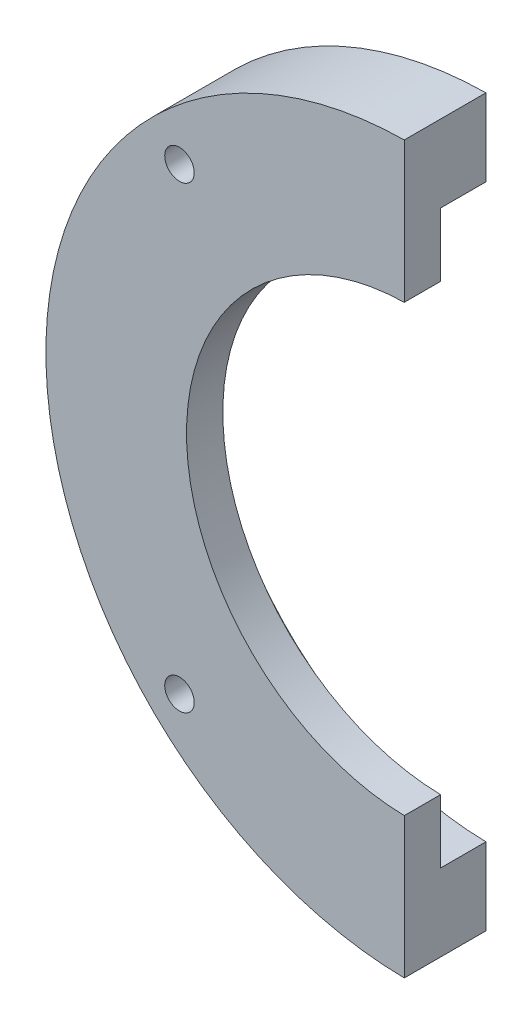
ISO-10303-21;
HEADER;
FILE_DESCRIPTION(('STEP AP214'),'2;1');
FILE_NAME('part.step','',(''),(''),'','','');
FILE_SCHEMA(('AUTOMOTIVE_DESIGN { 1 0 10303 214 1 1 1 1 }'));
ENDSEC;
DATA;
#1=APPLICATION_CONTEXT('core data for automotive mechanical design processes');
#2=APPLICATION_PROTOCOL_DEFINITION('international standard','automotive_design',2000,#1);
#3=PRODUCT_CONTEXT('',#1,'mechanical');
#4=PRODUCT('Part','Part','',(#3));
#5=PRODUCT_RELATED_PRODUCT_CATEGORY('part','',(#4));
#6=PRODUCT_DEFINITION_FORMATION('','',#4);
#7=PRODUCT_DEFINITION_CONTEXT('part definition',#1,'design');
#8=PRODUCT_DEFINITION('design','',#6,#7);
#9=PRODUCT_DEFINITION_SHAPE('','',#8);
#10=(LENGTH_UNIT() NAMED_UNIT(*) SI_UNIT(.MILLI.,.METRE.));
#11=(NAMED_UNIT(*) PLANE_ANGLE_UNIT() SI_UNIT($,.RADIAN.));
#12=(NAMED_UNIT(*) SI_UNIT($,.STERADIAN.) SOLID_ANGLE_UNIT());
#13=UNCERTAINTY_MEASURE_WITH_UNIT(LENGTH_MEASURE(1.E-05),#10,'distance_accuracy_value','');
#14=(GEOMETRIC_REPRESENTATION_CONTEXT(3) GLOBAL_UNCERTAINTY_ASSIGNED_CONTEXT((#13)) GLOBAL_UNIT_ASSIGNED_CONTEXT((#10,
#11,#12)) REPRESENTATION_CONTEXT('',''));
#15=CARTESIAN_POINT('',(0.,0.,0.));
#16=DIRECTION('',(0.,0.,1.));
#17=DIRECTION('',(1.,0.,0.));
#18=AXIS2_PLACEMENT_3D('',#15,#16,#17);
#19=CARTESIAN_POINT('',(0.,0.,18.));
#20=DIRECTION('',(0.,0.,-1.));
#21=DIRECTION('',(-1.,0.,0.));
#22=AXIS2_PLACEMENT_3D('',#19,#20,#21);
#23=CYLINDRICAL_SURFACE('',#22,80.);
#24=CARTESIAN_POINT('',(0.,0.,18.));
#25=DIRECTION('',(0.,0.,1.));
#26=DIRECTION('',(1.,0.,0.));
#27=AXIS2_PLACEMENT_3D('',#24,#25,#26);
#28=CIRCLE('',#27,80.);
#29=CARTESIAN_POINT('',(-1.,79.9937497558403,18.));
#30=VERTEX_POINT('',#29);
#31=CARTESIAN_POINT('',(-1.,-79.9937497558403,18.));
#32=VERTEX_POINT('',#31);
#33=EDGE_CURVE('E107',#30,#32,#28,.T.);
#34=ORIENTED_EDGE('',*,*,#33,.F.);
#35=DIRECTION('',(0.,0.,-1.));
#36=VECTOR('',#35,1.);
#37=CARTESIAN_POINT('',(-1.,79.9937497558403,18.));
#38=LINE('',#37,#36);
#39=CARTESIAN_POINT('',(-1.,79.9937497558403,0.));
#40=VERTEX_POINT('',#39);
#41=EDGE_CURVE('E94',#30,#40,#38,.T.);
#42=ORIENTED_EDGE('',*,*,#41,.T.);
#43=CARTESIAN_POINT('',(0.,0.,0.));
#44=DIRECTION('',(0.,0.,1.));
#45=DIRECTION('',(1.,0.,0.));
#46=AXIS2_PLACEMENT_3D('',#43,#44,#45);
#47=CIRCLE('',#46,80.);
#48=CARTESIAN_POINT('',(-1.,-79.9937497558403,0.));
#49=VERTEX_POINT('',#48);
#50=EDGE_CURVE('E101',#40,#49,#47,.T.);
#51=ORIENTED_EDGE('',*,*,#50,.T.);
#52=DIRECTION('',(0.,0.,-1.));
#53=VECTOR('',#52,1.);
#54=CARTESIAN_POINT('',(-1.,-79.9937497558403,18.));
#55=LINE('',#54,#53);
#56=EDGE_CURVE('E83',#32,#49,#55,.T.);
#57=ORIENTED_EDGE('',*,*,#56,.F.);
#58=EDGE_LOOP('',(#34,#42,#51,#57));
#59=FACE_BOUND('',#58,.T.);
#60=ADVANCED_FACE('F34',(#59),#23,.T.);
#61=CARTESIAN_POINT('',(0.,0.,18.));
#62=DIRECTION('',(0.,0.,1.));
#63=DIRECTION('',(1.,0.,0.));
#64=AXIS2_PLACEMENT_3D('',#61,#62,#63);
#65=PLANE('',#64);
#66=DIRECTION('',(0.,1.,0.));
#67=VECTOR('',#66,1.);
#68=CARTESIAN_POINT('',(-1.,-79.9937497558403,18.));
#69=LINE('',#68,#67);
#70=CARTESIAN_POINT('',(-1.,48.9897948556636,18.));
#71=VERTEX_POINT('',#70);
#72=EDGE_CURVE('E56',#71,#30,#69,.T.);
#73=ORIENTED_EDGE('',*,*,#72,.T.);
#74=ORIENTED_EDGE('',*,*,#33,.T.);
#75=CARTESIAN_POINT('',(-1.,-48.9897948556636,18.));
#76=VERTEX_POINT('',#75);
#77=EDGE_CURVE('E89',#32,#76,#69,.T.);
#78=ORIENTED_EDGE('',*,*,#77,.T.);
#79=CARTESIAN_POINT('',(0.,0.,18.));
#80=DIRECTION('',(0.,0.,-1.));
#81=DIRECTION('',(-1.,0.,0.));
#82=AXIS2_PLACEMENT_3D('',#79,#80,#81);
#83=CIRCLE('',#82,49.);
#84=EDGE_CURVE('E121',#76,#71,#83,.T.);
#85=ORIENTED_EDGE('',*,*,#84,.T.);
#86=EDGE_LOOP('',(#73,#74,#78,#85));
#87=FACE_BOUND('',#86,.T.);
#88=CARTESIAN_POINT('',(-50.558134854838,50.5581348548383,18.));
#89=DIRECTION('',(0.,0.,1.));
#90=DIRECTION('',(0.,-1.,0.));
#91=AXIS2_PLACEMENT_3D('',#88,#89,#90);
#92=CIRCLE('',#91,3.25);
#93=CARTESIAN_POINT('',(-50.558134854838,47.3081348548383,18.));
#94=VERTEX_POINT('',#93);
#95=EDGE_CURVE('E147',#94,#94,#92,.T.);
#96=ORIENTED_EDGE('',*,*,#95,.F.);
#97=EDGE_LOOP('',(#96));
#98=FACE_BOUND('',#97,.T.);
#99=CARTESIAN_POINT('',(-50.5581348548382,-50.5581348548382,18.));
#100=DIRECTION('',(0.,0.,1.));
#101=DIRECTION('',(1.,0.,0.));
#102=AXIS2_PLACEMENT_3D('',#99,#100,#101);
#103=CIRCLE('',#102,3.25);
#104=CARTESIAN_POINT('',(-47.3081348548381,-50.5581348548382,18.));
#105=VERTEX_POINT('',#104);
#106=EDGE_CURVE('E132',#105,#105,#103,.T.);
#107=ORIENTED_EDGE('',*,*,#106,.F.);
#108=EDGE_LOOP('',(#107));
#109=FACE_BOUND('',#108,.T.);
#110=ADVANCED_FACE('F154',(#87,#98,#109),#65,.T.);
#111=CARTESIAN_POINT('',(0.,0.,0.));
#112=DIRECTION('',(0.,0.,1.));
#113=DIRECTION('',(1.,0.,0.));
#114=AXIS2_PLACEMENT_3D('',#111,#112,#113);
#115=PLANE('',#114);
#116=CARTESIAN_POINT('',(-50.558134854838,50.5581348548383,0.));
#117=DIRECTION('',(0.,0.,1.));
#118=DIRECTION('',(0.,-1.,0.));
#119=AXIS2_PLACEMENT_3D('',#116,#117,#118);
#120=CIRCLE('',#119,3.25);
#121=CARTESIAN_POINT('',(-50.558134854838,47.3081348548383,0.));
#122=VERTEX_POINT('',#121);
#123=EDGE_CURVE('E144',#122,#122,#120,.T.);
#124=ORIENTED_EDGE('',*,*,#123,.T.);
#125=EDGE_LOOP('',(#124));
#126=FACE_BOUND('',#125,.T.);
#127=CARTESIAN_POINT('',(-50.5581348548382,-50.5581348548382,0.));
#128=DIRECTION('',(0.,0.,1.));
#129=DIRECTION('',(1.,0.,0.));
#130=AXIS2_PLACEMENT_3D('',#127,#128,#129);
#131=CIRCLE('',#130,3.25);
#132=CARTESIAN_POINT('',(-47.3081348548381,-50.5581348548382,0.));
#133=VERTEX_POINT('',#132);
#134=EDGE_CURVE('E127',#133,#133,#131,.T.);
#135=ORIENTED_EDGE('',*,*,#134,.T.);
#136=EDGE_LOOP('',(#135));
#137=FACE_BOUND('',#136,.T.);
#138=ORIENTED_EDGE('',*,*,#50,.F.);
#139=DIRECTION('',(0.,1.,0.));
#140=VECTOR('',#139,1.);
#141=CARTESIAN_POINT('',(-1.,-79.9937497558403,0.));
#142=LINE('',#141,#140);
#143=CARTESIAN_POINT('',(-1.,62.9920629920945,0.));
#144=VERTEX_POINT('',#143);
#145=EDGE_CURVE('E104',#144,#40,#142,.T.);
#146=ORIENTED_EDGE('',*,*,#145,.F.);
#147=CARTESIAN_POINT('',(0.,0.,0.));
#148=DIRECTION('',(0.,0.,-1.));
#149=DIRECTION('',(-1.,0.,0.));
#150=AXIS2_PLACEMENT_3D('',#147,#148,#149);
#151=CIRCLE('',#150,63.);
#152=CARTESIAN_POINT('',(-1.,-62.9920629920945,0.));
#153=VERTEX_POINT('',#152);
#154=EDGE_CURVE('E103',#153,#144,#151,.T.);
#155=ORIENTED_EDGE('',*,*,#154,.F.);
#156=EDGE_CURVE('E86',#49,#153,#142,.T.);
#157=ORIENTED_EDGE('',*,*,#156,.F.);
#158=EDGE_LOOP('',(#138,#146,#155,#157));
#159=FACE_BOUND('',#158,.T.);
#160=ADVANCED_FACE('F99',(#126,#137,#159),#115,.F.);
#161=CARTESIAN_POINT('',(0.,0.,10.));
#162=DIRECTION('',(0.,0.,-1.));
#163=DIRECTION('',(-1.,0.,0.));
#164=AXIS2_PLACEMENT_3D('',#161,#162,#163);
#165=CYLINDRICAL_SURFACE('',#164,63.);
#166=ORIENTED_EDGE('',*,*,#154,.T.);
#167=DIRECTION('',(0.,0.,-1.));
#168=VECTOR('',#167,1.);
#169=CARTESIAN_POINT('',(-1.,62.9920629920945,10.));
#170=LINE('',#169,#168);
#171=CARTESIAN_POINT('',(-1.,62.9920629920945,10.));
#172=VERTEX_POINT('',#171);
#173=EDGE_CURVE('E138',#144,#172,#170,.F.);
#174=ORIENTED_EDGE('',*,*,#173,.T.);
#175=CARTESIAN_POINT('',(0.,0.,10.));
#176=DIRECTION('',(0.,0.,-1.));
#177=DIRECTION('',(-1.,0.,0.));
#178=AXIS2_PLACEMENT_3D('',#175,#176,#177);
#179=CIRCLE('',#178,63.);
#180=CARTESIAN_POINT('',(-1.,-62.9920629920945,10.));
#181=VERTEX_POINT('',#180);
#182=EDGE_CURVE('E108',#181,#172,#179,.T.);
#183=ORIENTED_EDGE('',*,*,#182,.F.);
#184=DIRECTION('',(0.,0.,-1.));
#185=VECTOR('',#184,1.);
#186=CARTESIAN_POINT('',(-1.,-62.9920629920945,10.));
#187=LINE('',#186,#185);
#188=EDGE_CURVE('E139',#181,#153,#187,.T.);
#189=ORIENTED_EDGE('',*,*,#188,.T.);
#190=EDGE_LOOP('',(#166,#174,#183,#189));
#191=FACE_BOUND('',#190,.T.);
#192=ADVANCED_FACE('F137',(#191),#165,.F.);
#193=CARTESIAN_POINT('',(0.,0.,10.));
#194=DIRECTION('',(0.,0.,-1.));
#195=DIRECTION('',(-1.,0.,0.));
#196=AXIS2_PLACEMENT_3D('',#193,#194,#195);
#197=PLANE('',#196);
#198=DIRECTION('',(0.,1.,0.));
#199=VECTOR('',#198,1.);
#200=CARTESIAN_POINT('',(-1.,0.,10.));
#201=LINE('',#200,#199);
#202=CARTESIAN_POINT('',(-1.,-48.9897948556636,10.));
#203=VERTEX_POINT('',#202);
#204=EDGE_CURVE('E48',#181,#203,#201,.T.);
#205=ORIENTED_EDGE('',*,*,#204,.F.);
#206=ORIENTED_EDGE('',*,*,#182,.T.);
#207=CARTESIAN_POINT('',(-1.,48.9897948556636,10.));
#208=VERTEX_POINT('',#207);
#209=EDGE_CURVE('E126',#208,#172,#201,.T.);
#210=ORIENTED_EDGE('',*,*,#209,.F.);
#211=CARTESIAN_POINT('',(0.,0.,10.));
#212=DIRECTION('',(0.,0.,-1.));
#213=DIRECTION('',(-1.,0.,0.));
#214=AXIS2_PLACEMENT_3D('',#211,#212,#213);
#215=CIRCLE('',#214,49.);
#216=EDGE_CURVE('E119',#203,#208,#215,.T.);
#217=ORIENTED_EDGE('',*,*,#216,.F.);
#218=EDGE_LOOP('',(#205,#206,#210,#217));
#219=FACE_BOUND('',#218,.T.);
#220=ADVANCED_FACE('F124',(#219),#197,.T.);
#221=CARTESIAN_POINT('',(0.,0.,18.));
#222=DIRECTION('',(0.,0.,-1.));
#223=DIRECTION('',(-1.,0.,0.));
#224=AXIS2_PLACEMENT_3D('',#221,#222,#223);
#225=CYLINDRICAL_SURFACE('',#224,49.);
#226=ORIENTED_EDGE('',*,*,#216,.T.);
#227=DIRECTION('',(0.,0.,-1.));
#228=VECTOR('',#227,1.);
#229=CARTESIAN_POINT('',(-1.,48.9897948556636,18.));
#230=LINE('',#229,#228);
#231=EDGE_CURVE('E11',#208,#71,#230,.F.);
#232=ORIENTED_EDGE('',*,*,#231,.T.);
#233=ORIENTED_EDGE('',*,*,#84,.F.);
#234=DIRECTION('',(0.,0.,-1.));
#235=VECTOR('',#234,1.);
#236=CARTESIAN_POINT('',(-1.,-48.9897948556636,18.));
#237=LINE('',#236,#235);
#238=EDGE_CURVE('E41',#76,#203,#237,.T.);
#239=ORIENTED_EDGE('',*,*,#238,.T.);
#240=EDGE_LOOP('',(#226,#232,#233,#239));
#241=FACE_BOUND('',#240,.T.);
#242=ADVANCED_FACE('F118',(#241),#225,.F.);
#243=CARTESIAN_POINT('',(-50.5581348548382,-50.5581348548382,0.));
#244=DIRECTION('',(0.,0.,1.));
#245=DIRECTION('',(1.,0.,0.));
#246=AXIS2_PLACEMENT_3D('',#243,#244,#245);
#247=CYLINDRICAL_SURFACE('',#246,3.25);
#248=ORIENTED_EDGE('',*,*,#134,.F.);
#249=EDGE_LOOP('',(#248));
#250=FACE_BOUND('',#249,.T.);
#251=ORIENTED_EDGE('',*,*,#106,.T.);
#252=EDGE_LOOP('',(#251));
#253=FACE_BOUND('',#252,.T.);
#254=ADVANCED_FACE('F152',(#250,#253),#247,.F.);
#255=CARTESIAN_POINT('',(-50.558134854838,50.5581348548383,0.));
#256=DIRECTION('',(0.,0.,1.));
#257=DIRECTION('',(0.,-1.,0.));
#258=AXIS2_PLACEMENT_3D('',#255,#256,#257);
#259=CYLINDRICAL_SURFACE('',#258,3.25);
#260=ORIENTED_EDGE('',*,*,#123,.F.);
#261=EDGE_LOOP('',(#260));
#262=FACE_BOUND('',#261,.T.);
#263=ORIENTED_EDGE('',*,*,#95,.T.);
#264=EDGE_LOOP('',(#263));
#265=FACE_BOUND('',#264,.T.);
#266=ADVANCED_FACE('F173',(#262,#265),#259,.F.);
#267=CARTESIAN_POINT('',(-1.,-79.9937497558403,18.));
#268=DIRECTION('',(-1.,0.,0.));
#269=DIRECTION('',(0.,0.,1.));
#270=AXIS2_PLACEMENT_3D('',#267,#268,#269);
#271=PLANE('',#270);
#272=ORIENTED_EDGE('',*,*,#204,.T.);
#273=ORIENTED_EDGE('',*,*,#238,.F.);
#274=ORIENTED_EDGE('',*,*,#77,.F.);
#275=ORIENTED_EDGE('',*,*,#56,.T.);
#276=ORIENTED_EDGE('',*,*,#156,.T.);
#277=ORIENTED_EDGE('',*,*,#188,.F.);
#278=EDGE_LOOP('',(#272,#273,#274,#275,#276,#277));
#279=FACE_BOUND('',#278,.T.);
#280=ADVANCED_FACE('F85',(#279),#271,.F.);
#281=ORIENTED_EDGE('',*,*,#145,.T.);
#282=ORIENTED_EDGE('',*,*,#41,.F.);
#283=ORIENTED_EDGE('',*,*,#72,.F.);
#284=ORIENTED_EDGE('',*,*,#231,.F.);
#285=ORIENTED_EDGE('',*,*,#209,.T.);
#286=ORIENTED_EDGE('',*,*,#173,.F.);
#287=EDGE_LOOP('',(#281,#282,#283,#284,#285,#286));
#288=FACE_BOUND('',#287,.T.);
#289=ADVANCED_FACE('F178',(#288),#271,.F.);
#290=CLOSED_SHELL('',(#60,#110,#160,#192,#220,#242,#254,#266,#280,#289));
#291=MANIFOLD_SOLID_BREP('B2',#290);
#292=ADVANCED_BREP_SHAPE_REPRESENTATION('',(#18,#291),#14);
#293=SHAPE_DEFINITION_REPRESENTATION(#9,#292);
ENDSEC;
END-ISO-10303-21;
